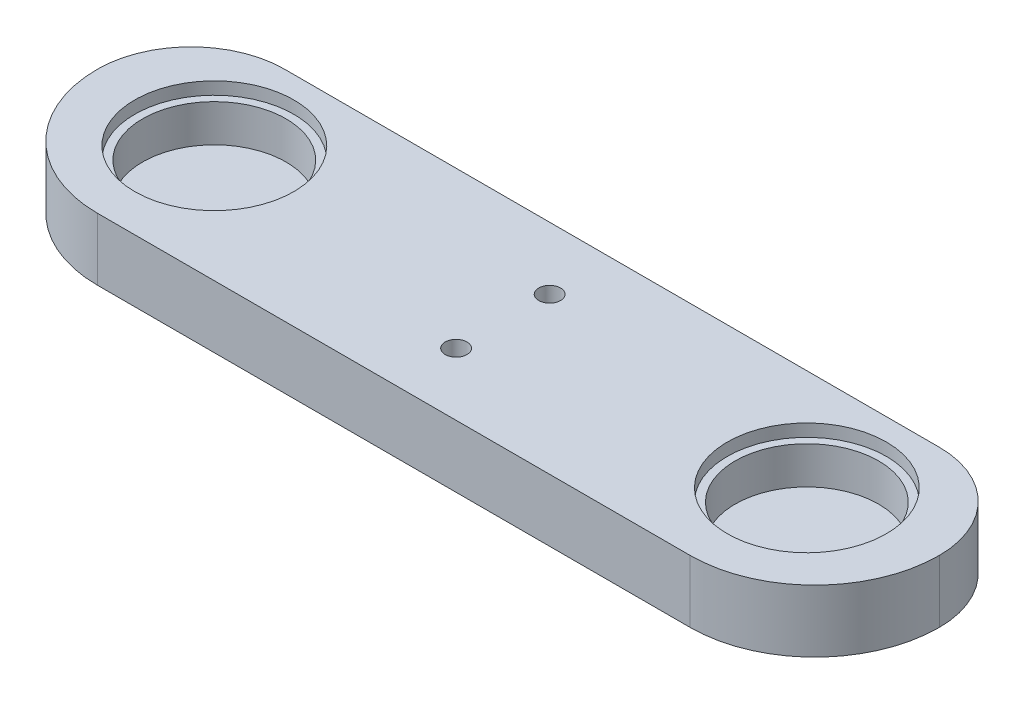
ISO-10303-21;
HEADER;
FILE_DESCRIPTION(('STEP AP214'),'2;1');
FILE_NAME('part.step','',(''),(''),'','','');
FILE_SCHEMA(('AUTOMOTIVE_DESIGN { 1 0 10303 214 1 1 1 1 }'));
ENDSEC;
DATA;
#1=APPLICATION_CONTEXT('core data for automotive mechanical design processes');
#2=APPLICATION_PROTOCOL_DEFINITION('international standard','automotive_design',2000,#1);
#3=PRODUCT_CONTEXT('',#1,'mechanical');
#4=PRODUCT('Part','Part','',(#3));
#5=PRODUCT_RELATED_PRODUCT_CATEGORY('part','',(#4));
#6=PRODUCT_DEFINITION_FORMATION('','',#4);
#7=PRODUCT_DEFINITION_CONTEXT('part definition',#1,'design');
#8=PRODUCT_DEFINITION('design','',#6,#7);
#9=PRODUCT_DEFINITION_SHAPE('','',#8);
#10=(LENGTH_UNIT() NAMED_UNIT(*) SI_UNIT(.MILLI.,.METRE.));
#11=(NAMED_UNIT(*) PLANE_ANGLE_UNIT() SI_UNIT($,.RADIAN.));
#12=(NAMED_UNIT(*) SI_UNIT($,.STERADIAN.) SOLID_ANGLE_UNIT());
#13=UNCERTAINTY_MEASURE_WITH_UNIT(LENGTH_MEASURE(1.E-05),#10,'distance_accuracy_value','');
#14=(GEOMETRIC_REPRESENTATION_CONTEXT(3) GLOBAL_UNCERTAINTY_ASSIGNED_CONTEXT((#13)) GLOBAL_UNIT_ASSIGNED_CONTEXT((#10,
#11,#12)) REPRESENTATION_CONTEXT('',''));
#15=CARTESIAN_POINT('',(0.,0.,0.));
#16=DIRECTION('',(0.,0.,1.));
#17=DIRECTION('',(1.,0.,0.));
#18=AXIS2_PLACEMENT_3D('',#15,#16,#17);
#19=CARTESIAN_POINT('',(19.7497982410927,-0.000999999999999265,15.6230701462917));
#20=DIRECTION('',(0.,1.,0.));
#21=DIRECTION('',(0.,0.,1.));
#22=AXIS2_PLACEMENT_3D('',#19,#20,#21);
#23=CYLINDRICAL_SURFACE('',#22,1.75);
#24=CARTESIAN_POINT('',(19.7497982410927,10.,15.6230701462917));
#25=DIRECTION('',(0.,1.,0.));
#26=DIRECTION('',(0.,0.,1.));
#27=AXIS2_PLACEMENT_3D('',#24,#25,#26);
#28=CIRCLE('',#27,1.75);
#29=CARTESIAN_POINT('',(19.7497982410927,10.,17.3730701462917));
#30=VERTEX_POINT('',#29);
#31=EDGE_CURVE('E133',#30,#30,#28,.T.);
#32=ORIENTED_EDGE('',*,*,#31,.T.);
#33=EDGE_LOOP('',(#32));
#34=FACE_BOUND('',#33,.T.);
#35=CARTESIAN_POINT('',(19.7497982410927,4.,15.6230701462917));
#36=DIRECTION('',(0.,-1.,0.));
#37=DIRECTION('',(0.,0.,-1.));
#38=AXIS2_PLACEMENT_3D('',#35,#36,#37);
#39=CIRCLE('',#38,1.75);
#40=CARTESIAN_POINT('',(19.7497982410927,4.,13.8730701462917));
#41=VERTEX_POINT('',#40);
#42=EDGE_CURVE('E129',#41,#41,#39,.F.);
#43=ORIENTED_EDGE('',*,*,#42,.F.);
#44=EDGE_LOOP('',(#43));
#45=FACE_BOUND('',#44,.T.);
#46=ADVANCED_FACE('F32',(#34,#45),#23,.F.);
#47=CARTESIAN_POINT('',(19.7497982410927,-0.000999999999999265,0.623070146291696));
#48=DIRECTION('',(0.,1.,0.));
#49=DIRECTION('',(0.,0.,1.));
#50=AXIS2_PLACEMENT_3D('',#47,#48,#49);
#51=CYLINDRICAL_SURFACE('',#50,1.75);
#52=CARTESIAN_POINT('',(19.7497982410927,10.,0.623070146291696));
#53=DIRECTION('',(0.,1.,0.));
#54=DIRECTION('',(0.,0.,1.));
#55=AXIS2_PLACEMENT_3D('',#52,#53,#54);
#56=CIRCLE('',#55,1.75);
#57=CARTESIAN_POINT('',(19.7497982410927,10.,2.37307014629169));
#58=VERTEX_POINT('',#57);
#59=EDGE_CURVE('E187',#58,#58,#56,.T.);
#60=ORIENTED_EDGE('',*,*,#59,.T.);
#61=EDGE_LOOP('',(#60));
#62=FACE_BOUND('',#61,.T.);
#63=CARTESIAN_POINT('',(19.7497982410927,4.,0.623070146291696));
#64=DIRECTION('',(0.,-1.,0.));
#65=DIRECTION('',(0.,0.,-1.));
#66=AXIS2_PLACEMENT_3D('',#63,#64,#65);
#67=CIRCLE('',#66,1.75);
#68=CARTESIAN_POINT('',(19.7497982410927,4.,-1.1269298537083));
#69=VERTEX_POINT('',#68);
#70=EDGE_CURVE('E126',#69,#69,#67,.F.);
#71=ORIENTED_EDGE('',*,*,#70,.F.);
#72=EDGE_LOOP('',(#71));
#73=FACE_BOUND('',#72,.T.);
#74=ADVANCED_FACE('F237',(#62,#73),#51,.F.);
#75=CARTESIAN_POINT('',(-47.7502017589073,10.,25.6230701462917));
#76=DIRECTION('',(0.,0.,-1.));
#77=DIRECTION('',(-1.,0.,0.));
#78=AXIS2_PLACEMENT_3D('',#75,#76,#77);
#79=PLANE('',#78);
#80=DIRECTION('',(1.,0.,0.));
#81=VECTOR('',#80,1.);
#82=CARTESIAN_POINT('',(-47.7502017589073,0.,25.6230701462917));
#83=LINE('',#82,#81);
#84=CARTESIAN_POINT('',(-27.7502017589073,0.,25.6230701462917));
#85=VERTEX_POINT('',#84);
#86=CARTESIAN_POINT('',(67.2497982410927,0.,25.6230701462917));
#87=VERTEX_POINT('',#86);
#88=EDGE_CURVE('E147',#85,#87,#83,.T.);
#89=ORIENTED_EDGE('',*,*,#88,.T.);
#90=DIRECTION('',(0.,-1.,0.));
#91=VECTOR('',#90,1.);
#92=CARTESIAN_POINT('',(67.2497982410927,10.,25.6230701462917));
#93=LINE('',#92,#91);
#94=CARTESIAN_POINT('',(67.2497982410927,10.,25.6230701462917));
#95=VERTEX_POINT('',#94);
#96=EDGE_CURVE('E102',#87,#95,#93,.F.);
#97=ORIENTED_EDGE('',*,*,#96,.T.);
#98=DIRECTION('',(1.,0.,0.));
#99=VECTOR('',#98,1.);
#100=CARTESIAN_POINT('',(-47.7502017589073,10.,25.6230701462917));
#101=LINE('',#100,#99);
#102=CARTESIAN_POINT('',(-27.7502017589073,10.,25.6230701462917));
#103=VERTEX_POINT('',#102);
#104=EDGE_CURVE('E111',#103,#95,#101,.T.);
#105=ORIENTED_EDGE('',*,*,#104,.F.);
#106=DIRECTION('',(0.,-1.,0.));
#107=VECTOR('',#106,1.);
#108=CARTESIAN_POINT('',(-27.7502017589073,10.,25.6230701462917));
#109=LINE('',#108,#107);
#110=EDGE_CURVE('E103',#103,#85,#109,.T.);
#111=ORIENTED_EDGE('',*,*,#110,.T.);
#112=EDGE_LOOP('',(#89,#97,#105,#111));
#113=FACE_BOUND('',#112,.T.);
#114=ADVANCED_FACE('F149',(#113),#79,.F.);
#115=CARTESIAN_POINT('',(-47.7502017589073,10.,-9.3769298537083));
#116=DIRECTION('',(0.,0.,1.));
#117=DIRECTION('',(1.,0.,0.));
#118=AXIS2_PLACEMENT_3D('',#115,#116,#117);
#119=PLANE('',#118);
#120=DIRECTION('',(-1.,0.,0.));
#121=VECTOR('',#120,1.);
#122=CARTESIAN_POINT('',(-47.7502017589073,10.,-9.3769298537083));
#123=LINE('',#122,#121);
#124=CARTESIAN_POINT('',(72.2497982410927,10.,-9.3769298537083));
#125=VERTEX_POINT('',#124);
#126=CARTESIAN_POINT('',(-32.7502017589073,10.,-9.3769298537083));
#127=VERTEX_POINT('',#126);
#128=EDGE_CURVE('E107',#125,#127,#123,.T.);
#129=ORIENTED_EDGE('',*,*,#128,.F.);
#130=DIRECTION('',(0.,-1.,0.));
#131=VECTOR('',#130,1.);
#132=CARTESIAN_POINT('',(72.2497982410927,10.,-9.3769298537083));
#133=LINE('',#132,#131);
#134=CARTESIAN_POINT('',(72.2497982410927,0.,-9.3769298537083));
#135=VERTEX_POINT('',#134);
#136=EDGE_CURVE('E135',#125,#135,#133,.T.);
#137=ORIENTED_EDGE('',*,*,#136,.T.);
#138=DIRECTION('',(-1.,0.,0.));
#139=VECTOR('',#138,1.);
#140=CARTESIAN_POINT('',(-47.7502017589073,0.,-9.3769298537083));
#141=LINE('',#140,#139);
#142=CARTESIAN_POINT('',(-32.7502017589073,0.,-9.3769298537083));
#143=VERTEX_POINT('',#142);
#144=EDGE_CURVE('E89',#135,#143,#141,.T.);
#145=ORIENTED_EDGE('',*,*,#144,.T.);
#146=DIRECTION('',(0.,-1.,0.));
#147=VECTOR('',#146,1.);
#148=CARTESIAN_POINT('',(-32.7502017589073,10.,-9.3769298537083));
#149=LINE('',#148,#147);
#150=EDGE_CURVE('E47',#143,#127,#149,.F.);
#151=ORIENTED_EDGE('',*,*,#150,.T.);
#152=EDGE_LOOP('',(#129,#137,#145,#151));
#153=FACE_BOUND('',#152,.T.);
#154=ADVANCED_FACE('F275',(#153),#119,.F.);
#155=CARTESIAN_POINT('',(0.,10.,0.));
#156=DIRECTION('',(0.,1.,0.));
#157=DIRECTION('',(0.,0.,1.));
#158=AXIS2_PLACEMENT_3D('',#155,#156,#157);
#159=PLANE('',#158);
#160=ORIENTED_EDGE('',*,*,#59,.F.);
#161=EDGE_LOOP('',(#160));
#162=FACE_BOUND('',#161,.T.);
#163=ORIENTED_EDGE('',*,*,#31,.F.);
#164=EDGE_LOOP('',(#163));
#165=FACE_BOUND('',#164,.T.);
#166=CARTESIAN_POINT('',(-27.7502017589073,10.,6.88629089006511));
#167=DIRECTION('',(0.,1.,0.));
#168=DIRECTION('',(0.,0.,1.));
#169=AXIS2_PLACEMENT_3D('',#166,#167,#168);
#170=CIRCLE('',#169,12.75);
#171=CARTESIAN_POINT('',(-27.7502017589073,10.,19.6362908900651));
#172=VERTEX_POINT('',#171);
#173=EDGE_CURVE('E156',#172,#172,#170,.T.);
#174=ORIENTED_EDGE('',*,*,#173,.F.);
#175=EDGE_LOOP('',(#174));
#176=FACE_BOUND('',#175,.T.);
#177=CARTESIAN_POINT('',(67.2497982410927,10.,6.88629089006511));
#178=DIRECTION('',(0.,1.,0.));
#179=DIRECTION('',(0.,0.,-1.));
#180=AXIS2_PLACEMENT_3D('',#177,#178,#179);
#181=CIRCLE('',#180,12.75);
#182=CARTESIAN_POINT('',(67.2497982410927,10.,-5.86370910993491));
#183=VERTEX_POINT('',#182);
#184=EDGE_CURVE('E152',#183,#183,#181,.T.);
#185=ORIENTED_EDGE('',*,*,#184,.F.);
#186=EDGE_LOOP('',(#185));
#187=FACE_BOUND('',#186,.T.);
#188=CARTESIAN_POINT('',(67.2497982410927,10.,5.6230701462917));
#189=DIRECTION('',(0.,1.,0.));
#190=DIRECTION('',(0.,0.,1.));
#191=AXIS2_PLACEMENT_3D('',#188,#189,#190);
#192=CIRCLE('',#191,20.);
#193=CARTESIAN_POINT('',(87.2497982410927,10.,5.6230701462917));
#194=VERTEX_POINT('',#193);
#195=EDGE_CURVE('E121',#95,#194,#192,.T.);
#196=ORIENTED_EDGE('',*,*,#195,.T.);
#197=CARTESIAN_POINT('',(72.2497982410927,10.,5.62307014629169));
#198=DIRECTION('',(0.,1.,0.));
#199=DIRECTION('',(0.,0.,1.));
#200=AXIS2_PLACEMENT_3D('',#197,#198,#199);
#201=CIRCLE('',#200,15.);
#202=EDGE_CURVE('E11',#194,#125,#201,.T.);
#203=ORIENTED_EDGE('',*,*,#202,.T.);
#204=ORIENTED_EDGE('',*,*,#128,.T.);
#205=CARTESIAN_POINT('',(-32.7502017589073,10.,5.62307014629169));
#206=DIRECTION('',(0.,1.,0.));
#207=DIRECTION('',(0.,0.,1.));
#208=AXIS2_PLACEMENT_3D('',#205,#206,#207);
#209=CIRCLE('',#208,15.);
#210=CARTESIAN_POINT('',(-47.7502017589073,10.,5.6230701462917));
#211=VERTEX_POINT('',#210);
#212=EDGE_CURVE('E40',#127,#211,#209,.T.);
#213=ORIENTED_EDGE('',*,*,#212,.T.);
#214=CARTESIAN_POINT('',(-27.7502017589073,10.,5.6230701462917));
#215=DIRECTION('',(0.,1.,0.));
#216=DIRECTION('',(0.,0.,1.));
#217=AXIS2_PLACEMENT_3D('',#214,#215,#216);
#218=CIRCLE('',#217,20.);
#219=EDGE_CURVE('E119',#211,#103,#218,.T.);
#220=ORIENTED_EDGE('',*,*,#219,.T.);
#221=ORIENTED_EDGE('',*,*,#104,.T.);
#222=EDGE_LOOP('',(#196,#203,#204,#213,#220,#221));
#223=FACE_BOUND('',#222,.T.);
#224=ADVANCED_FACE('F139',(#162,#165,#176,#187,#223),#159,.T.);
#225=CARTESIAN_POINT('',(0.,0.,0.));
#226=DIRECTION('',(0.,1.,0.));
#227=DIRECTION('',(0.,0.,1.));
#228=AXIS2_PLACEMENT_3D('',#225,#226,#227);
#229=PLANE('',#228);
#230=CARTESIAN_POINT('',(19.7497982410927,0.,15.6230701462917));
#231=DIRECTION('',(0.,-1.,0.));
#232=DIRECTION('',(0.,0.,-1.));
#233=AXIS2_PLACEMENT_3D('',#230,#231,#232);
#234=CIRCLE('',#233,3.1);
#235=CARTESIAN_POINT('',(19.7497982410927,0.,12.5230701462917));
#236=VERTEX_POINT('',#235);
#237=EDGE_CURVE('E201',#236,#236,#234,.T.);
#238=ORIENTED_EDGE('',*,*,#237,.F.);
#239=EDGE_LOOP('',(#238));
#240=FACE_BOUND('',#239,.T.);
#241=CARTESIAN_POINT('',(19.7497982410927,0.,0.623070146291696));
#242=DIRECTION('',(0.,-1.,0.));
#243=DIRECTION('',(0.,0.,-1.));
#244=AXIS2_PLACEMENT_3D('',#241,#242,#243);
#245=CIRCLE('',#244,3.1);
#246=CARTESIAN_POINT('',(19.7497982410927,0.,-2.47692985370831));
#247=VERTEX_POINT('',#246);
#248=EDGE_CURVE('E195',#247,#247,#245,.T.);
#249=ORIENTED_EDGE('',*,*,#248,.F.);
#250=EDGE_LOOP('',(#249));
#251=FACE_BOUND('',#250,.T.);
#252=ORIENTED_EDGE('',*,*,#144,.F.);
#253=CARTESIAN_POINT('',(72.2497982410927,0.,5.62307014629169));
#254=DIRECTION('',(0.,1.,0.));
#255=DIRECTION('',(0.,0.,1.));
#256=AXIS2_PLACEMENT_3D('',#253,#254,#255);
#257=CIRCLE('',#256,15.);
#258=CARTESIAN_POINT('',(87.2497982410927,0.,5.6230701462917));
#259=VERTEX_POINT('',#258);
#260=EDGE_CURVE('E83',#135,#259,#257,.F.);
#261=ORIENTED_EDGE('',*,*,#260,.T.);
#262=CARTESIAN_POINT('',(67.2497982410927,0.,5.6230701462917));
#263=DIRECTION('',(0.,1.,0.));
#264=DIRECTION('',(0.,0.,1.));
#265=AXIS2_PLACEMENT_3D('',#262,#263,#264);
#266=CIRCLE('',#265,20.);
#267=EDGE_CURVE('E87',#259,#87,#266,.F.);
#268=ORIENTED_EDGE('',*,*,#267,.T.);
#269=ORIENTED_EDGE('',*,*,#88,.F.);
#270=CARTESIAN_POINT('',(-27.7502017589073,0.,5.6230701462917));
#271=DIRECTION('',(0.,1.,0.));
#272=DIRECTION('',(0.,0.,1.));
#273=AXIS2_PLACEMENT_3D('',#270,#271,#272);
#274=CIRCLE('',#273,20.);
#275=CARTESIAN_POINT('',(-47.7502017589073,0.,5.6230701462917));
#276=VERTEX_POINT('',#275);
#277=EDGE_CURVE('E104',#85,#276,#274,.F.);
#278=ORIENTED_EDGE('',*,*,#277,.T.);
#279=CARTESIAN_POINT('',(-32.7502017589073,0.,5.62307014629169));
#280=DIRECTION('',(0.,1.,0.));
#281=DIRECTION('',(0.,0.,1.));
#282=AXIS2_PLACEMENT_3D('',#279,#280,#281);
#283=CIRCLE('',#282,15.);
#284=EDGE_CURVE('E94',#276,#143,#283,.F.);
#285=ORIENTED_EDGE('',*,*,#284,.T.);
#286=EDGE_LOOP('',(#252,#261,#268,#269,#278,#285));
#287=FACE_BOUND('',#286,.T.);
#288=ADVANCED_FACE('F85',(#240,#251,#287),#229,.F.);
#289=CARTESIAN_POINT('',(67.2497982410927,10.,5.6230701462917));
#290=DIRECTION('',(0.,-1.,0.));
#291=DIRECTION('',(0.,0.,-1.));
#292=AXIS2_PLACEMENT_3D('',#289,#290,#291);
#293=CYLINDRICAL_SURFACE('',#292,20.);
#294=ORIENTED_EDGE('',*,*,#195,.F.);
#295=ORIENTED_EDGE('',*,*,#96,.F.);
#296=ORIENTED_EDGE('',*,*,#267,.F.);
#297=DIRECTION('',(0.,-1.,0.));
#298=VECTOR('',#297,1.);
#299=CARTESIAN_POINT('',(87.2497982410927,10.,5.6230701462917));
#300=LINE('',#299,#298);
#301=EDGE_CURVE('E101',#194,#259,#300,.T.);
#302=ORIENTED_EDGE('',*,*,#301,.F.);
#303=EDGE_LOOP('',(#294,#295,#296,#302));
#304=FACE_BOUND('',#303,.T.);
#305=ADVANCED_FACE('F100',(#304),#293,.T.);
#306=CARTESIAN_POINT('',(-27.7502017589073,10.,5.6230701462917));
#307=DIRECTION('',(0.,-1.,0.));
#308=DIRECTION('',(0.,0.,-1.));
#309=AXIS2_PLACEMENT_3D('',#306,#307,#308);
#310=CYLINDRICAL_SURFACE('',#309,20.);
#311=ORIENTED_EDGE('',*,*,#219,.F.);
#312=DIRECTION('',(0.,-1.,0.));
#313=VECTOR('',#312,1.);
#314=CARTESIAN_POINT('',(-47.7502017589073,10.,5.6230701462917));
#315=LINE('',#314,#313);
#316=EDGE_CURVE('E123',#276,#211,#315,.F.);
#317=ORIENTED_EDGE('',*,*,#316,.F.);
#318=ORIENTED_EDGE('',*,*,#277,.F.);
#319=ORIENTED_EDGE('',*,*,#110,.F.);
#320=EDGE_LOOP('',(#311,#317,#318,#319));
#321=FACE_BOUND('',#320,.T.);
#322=ADVANCED_FACE('F146',(#321),#310,.T.);
#323=CARTESIAN_POINT('',(67.2497982410927,8.,6.88629089006511));
#324=DIRECTION('',(0.,1.,0.));
#325=DIRECTION('',(0.,0.,1.));
#326=AXIS2_PLACEMENT_3D('',#323,#324,#325);
#327=CYLINDRICAL_SURFACE('',#326,12.75);
#328=CARTESIAN_POINT('',(67.2497982410927,8.,6.88629089006511));
#329=DIRECTION('',(0.,1.,0.));
#330=DIRECTION('',(0.,0.,-1.));
#331=AXIS2_PLACEMENT_3D('',#328,#329,#330);
#332=CIRCLE('',#331,12.75);
#333=CARTESIAN_POINT('',(67.2497982410927,8.,-5.86370910993491));
#334=VERTEX_POINT('',#333);
#335=EDGE_CURVE('E161',#334,#334,#332,.T.);
#336=ORIENTED_EDGE('',*,*,#335,.F.);
#337=EDGE_LOOP('',(#336));
#338=FACE_BOUND('',#337,.T.);
#339=ORIENTED_EDGE('',*,*,#184,.T.);
#340=EDGE_LOOP('',(#339));
#341=FACE_BOUND('',#340,.T.);
#342=ADVANCED_FACE('F269',(#338,#341),#327,.F.);
#343=CARTESIAN_POINT('',(67.2497982410927,8.,6.88629089006511));
#344=DIRECTION('',(0.,-1.,0.));
#345=DIRECTION('',(0.,0.,-1.));
#346=AXIS2_PLACEMENT_3D('',#343,#344,#345);
#347=PLANE('',#346);
#348=CARTESIAN_POINT('',(67.2497982410927,8.,6.88629089006511));
#349=DIRECTION('',(0.,1.,0.));
#350=DIRECTION('',(0.,0.,-1.));
#351=AXIS2_PLACEMENT_3D('',#348,#349,#350);
#352=CIRCLE('',#351,11.5);
#353=CARTESIAN_POINT('',(67.2497982410927,8.,-4.6137091099349));
#354=VERTEX_POINT('',#353);
#355=EDGE_CURVE('E164',#354,#354,#352,.T.);
#356=ORIENTED_EDGE('',*,*,#355,.F.);
#357=EDGE_LOOP('',(#356));
#358=FACE_BOUND('',#357,.T.);
#359=ORIENTED_EDGE('',*,*,#335,.T.);
#360=EDGE_LOOP('',(#359));
#361=FACE_BOUND('',#360,.T.);
#362=ADVANCED_FACE('F265',(#358,#361),#347,.F.);
#363=CARTESIAN_POINT('',(-27.7502017589073,8.,6.88629089006511));
#364=DIRECTION('',(0.,1.,0.));
#365=DIRECTION('',(0.,0.,1.));
#366=AXIS2_PLACEMENT_3D('',#363,#364,#365);
#367=CYLINDRICAL_SURFACE('',#366,12.75);
#368=CARTESIAN_POINT('',(-27.7502017589073,8.,6.88629089006511));
#369=DIRECTION('',(0.,1.,0.));
#370=DIRECTION('',(0.,0.,1.));
#371=AXIS2_PLACEMENT_3D('',#368,#369,#370);
#372=CIRCLE('',#371,12.75);
#373=CARTESIAN_POINT('',(-27.7502017589073,8.,19.6362908900651));
#374=VERTEX_POINT('',#373);
#375=EDGE_CURVE('E154',#374,#374,#372,.T.);
#376=ORIENTED_EDGE('',*,*,#375,.F.);
#377=EDGE_LOOP('',(#376));
#378=FACE_BOUND('',#377,.T.);
#379=ORIENTED_EDGE('',*,*,#173,.T.);
#380=EDGE_LOOP('',(#379));
#381=FACE_BOUND('',#380,.T.);
#382=ADVANCED_FACE('F261',(#378,#381),#367,.F.);
#383=CARTESIAN_POINT('',(-27.7502017589073,8.,6.88629089006511));
#384=DIRECTION('',(0.,1.,0.));
#385=DIRECTION('',(0.,0.,1.));
#386=AXIS2_PLACEMENT_3D('',#383,#384,#385);
#387=PLANE('',#386);
#388=CARTESIAN_POINT('',(-27.7502017589073,8.,6.88629089006511));
#389=DIRECTION('',(0.,1.,0.));
#390=DIRECTION('',(0.,0.,1.));
#391=AXIS2_PLACEMENT_3D('',#388,#389,#390);
#392=CIRCLE('',#391,11.5);
#393=CARTESIAN_POINT('',(-27.7502017589073,8.,18.3862908900651));
#394=VERTEX_POINT('',#393);
#395=EDGE_CURVE('E174',#394,#394,#392,.T.);
#396=ORIENTED_EDGE('',*,*,#395,.F.);
#397=EDGE_LOOP('',(#396));
#398=FACE_BOUND('',#397,.T.);
#399=ORIENTED_EDGE('',*,*,#375,.T.);
#400=EDGE_LOOP('',(#399));
#401=FACE_BOUND('',#400,.T.);
#402=ADVANCED_FACE('F252',(#398,#401),#387,.T.);
#403=CARTESIAN_POINT('',(-27.7502017589073,2.,6.88629089006511));
#404=DIRECTION('',(0.,1.,0.));
#405=DIRECTION('',(0.,0.,1.));
#406=AXIS2_PLACEMENT_3D('',#403,#404,#405);
#407=CYLINDRICAL_SURFACE('',#406,11.5);
#408=CARTESIAN_POINT('',(-27.7502017589073,2.,6.88629089006511));
#409=DIRECTION('',(0.,1.,0.));
#410=DIRECTION('',(0.,0.,1.));
#411=AXIS2_PLACEMENT_3D('',#408,#409,#410);
#412=CIRCLE('',#411,11.5);
#413=CARTESIAN_POINT('',(-27.7502017589073,2.,18.3862908900651));
#414=VERTEX_POINT('',#413);
#415=EDGE_CURVE('E170',#414,#414,#412,.T.);
#416=ORIENTED_EDGE('',*,*,#415,.F.);
#417=EDGE_LOOP('',(#416));
#418=FACE_BOUND('',#417,.T.);
#419=ORIENTED_EDGE('',*,*,#395,.T.);
#420=EDGE_LOOP('',(#419));
#421=FACE_BOUND('',#420,.T.);
#422=ADVANCED_FACE('F249',(#418,#421),#407,.F.);
#423=CARTESIAN_POINT('',(-27.7502017589073,2.,6.88629089006511));
#424=DIRECTION('',(0.,1.,0.));
#425=DIRECTION('',(0.,0.,1.));
#426=AXIS2_PLACEMENT_3D('',#423,#424,#425);
#427=PLANE('',#426);
#428=ORIENTED_EDGE('',*,*,#415,.T.);
#429=EDGE_LOOP('',(#428));
#430=FACE_BOUND('',#429,.T.);
#431=ADVANCED_FACE('F245',(#430),#427,.T.);
#432=CARTESIAN_POINT('',(67.2497982410927,2.,6.88629089006511));
#433=DIRECTION('',(0.,1.,0.));
#434=DIRECTION('',(0.,0.,1.));
#435=AXIS2_PLACEMENT_3D('',#432,#433,#434);
#436=CYLINDRICAL_SURFACE('',#435,11.5);
#437=CARTESIAN_POINT('',(67.2497982410927,2.,6.88629089006511));
#438=DIRECTION('',(0.,1.,0.));
#439=DIRECTION('',(0.,0.,-1.));
#440=AXIS2_PLACEMENT_3D('',#437,#438,#439);
#441=CIRCLE('',#440,11.5);
#442=CARTESIAN_POINT('',(67.2497982410927,2.,-4.6137091099349));
#443=VERTEX_POINT('',#442);
#444=EDGE_CURVE('E179',#443,#443,#441,.T.);
#445=ORIENTED_EDGE('',*,*,#444,.F.);
#446=EDGE_LOOP('',(#445));
#447=FACE_BOUND('',#446,.T.);
#448=ORIENTED_EDGE('',*,*,#355,.T.);
#449=EDGE_LOOP('',(#448));
#450=FACE_BOUND('',#449,.T.);
#451=ADVANCED_FACE('F248',(#447,#450),#436,.F.);
#452=CARTESIAN_POINT('',(67.2497982410927,2.,6.88629089006511));
#453=DIRECTION('',(0.,-1.,0.));
#454=DIRECTION('',(0.,0.,-1.));
#455=AXIS2_PLACEMENT_3D('',#452,#453,#454);
#456=PLANE('',#455);
#457=ORIENTED_EDGE('',*,*,#444,.T.);
#458=EDGE_LOOP('',(#457));
#459=FACE_BOUND('',#458,.T.);
#460=ADVANCED_FACE('F231',(#459),#456,.F.);
#461=CARTESIAN_POINT('',(19.7497982410927,4.,0.623070146291696));
#462=DIRECTION('',(0.,-1.,0.));
#463=DIRECTION('',(0.,0.,-1.));
#464=AXIS2_PLACEMENT_3D('',#461,#462,#463);
#465=PLANE('',#464);
#466=CARTESIAN_POINT('',(19.7497982410927,4.,0.623070146291696));
#467=DIRECTION('',(0.,-1.,0.));
#468=DIRECTION('',(0.,0.,-1.));
#469=AXIS2_PLACEMENT_3D('',#466,#467,#468);
#470=CIRCLE('',#469,3.1);
#471=CARTESIAN_POINT('',(19.7497982410927,4.,-2.47692985370831));
#472=VERTEX_POINT('',#471);
#473=EDGE_CURVE('E198',#472,#472,#470,.T.);
#474=ORIENTED_EDGE('',*,*,#473,.T.);
#475=EDGE_LOOP('',(#474));
#476=FACE_BOUND('',#475,.T.);
#477=ORIENTED_EDGE('',*,*,#70,.T.);
#478=EDGE_LOOP('',(#477));
#479=FACE_BOUND('',#478,.T.);
#480=ADVANCED_FACE('F223',(#476,#479),#465,.T.);
#481=CARTESIAN_POINT('',(19.7497982410927,4.,0.623070146291696));
#482=DIRECTION('',(0.,-1.,0.));
#483=DIRECTION('',(0.,0.,-1.));
#484=AXIS2_PLACEMENT_3D('',#481,#482,#483);
#485=CYLINDRICAL_SURFACE('',#484,3.1);
#486=ORIENTED_EDGE('',*,*,#473,.F.);
#487=EDGE_LOOP('',(#486));
#488=FACE_BOUND('',#487,.T.);
#489=ORIENTED_EDGE('',*,*,#248,.T.);
#490=EDGE_LOOP('',(#489));
#491=FACE_BOUND('',#490,.T.);
#492=ADVANCED_FACE('F221',(#488,#491),#485,.F.);
#493=CARTESIAN_POINT('',(19.7497982410927,4.,15.6230701462917));
#494=DIRECTION('',(0.,-1.,0.));
#495=DIRECTION('',(0.,0.,-1.));
#496=AXIS2_PLACEMENT_3D('',#493,#494,#495);
#497=PLANE('',#496);
#498=CARTESIAN_POINT('',(19.7497982410927,4.,15.6230701462917));
#499=DIRECTION('',(0.,-1.,0.));
#500=DIRECTION('',(0.,0.,-1.));
#501=AXIS2_PLACEMENT_3D('',#498,#499,#500);
#502=CIRCLE('',#501,3.1);
#503=CARTESIAN_POINT('',(19.7497982410927,4.,12.5230701462917));
#504=VERTEX_POINT('',#503);
#505=EDGE_CURVE('E130',#504,#504,#502,.T.);
#506=ORIENTED_EDGE('',*,*,#505,.T.);
#507=EDGE_LOOP('',(#506));
#508=FACE_BOUND('',#507,.T.);
#509=ORIENTED_EDGE('',*,*,#42,.T.);
#510=EDGE_LOOP('',(#509));
#511=FACE_BOUND('',#510,.T.);
#512=ADVANCED_FACE('F207',(#508,#511),#497,.T.);
#513=CARTESIAN_POINT('',(19.7497982410927,4.,15.6230701462917));
#514=DIRECTION('',(0.,-1.,0.));
#515=DIRECTION('',(0.,0.,-1.));
#516=AXIS2_PLACEMENT_3D('',#513,#514,#515);
#517=CYLINDRICAL_SURFACE('',#516,3.1);
#518=ORIENTED_EDGE('',*,*,#505,.F.);
#519=EDGE_LOOP('',(#518));
#520=FACE_BOUND('',#519,.T.);
#521=ORIENTED_EDGE('',*,*,#237,.T.);
#522=EDGE_LOOP('',(#521));
#523=FACE_BOUND('',#522,.T.);
#524=ADVANCED_FACE('F210',(#520,#523),#517,.F.);
#525=CARTESIAN_POINT('',(72.2497982410927,10.,5.62307014629169));
#526=DIRECTION('',(0.,-1.,0.));
#527=DIRECTION('',(0.,0.,-1.));
#528=AXIS2_PLACEMENT_3D('',#525,#526,#527);
#529=CYLINDRICAL_SURFACE('',#528,15.);
#530=ORIENTED_EDGE('',*,*,#202,.F.);
#531=ORIENTED_EDGE('',*,*,#301,.T.);
#532=ORIENTED_EDGE('',*,*,#260,.F.);
#533=ORIENTED_EDGE('',*,*,#136,.F.);
#534=EDGE_LOOP('',(#530,#531,#532,#533));
#535=FACE_BOUND('',#534,.T.);
#536=ADVANCED_FACE('F106',(#535),#529,.T.);
#537=CARTESIAN_POINT('',(-32.7502017589073,10.,5.62307014629169));
#538=DIRECTION('',(0.,-1.,0.));
#539=DIRECTION('',(0.,0.,-1.));
#540=AXIS2_PLACEMENT_3D('',#537,#538,#539);
#541=CYLINDRICAL_SURFACE('',#540,15.);
#542=ORIENTED_EDGE('',*,*,#212,.F.);
#543=ORIENTED_EDGE('',*,*,#150,.F.);
#544=ORIENTED_EDGE('',*,*,#284,.F.);
#545=ORIENTED_EDGE('',*,*,#316,.T.);
#546=EDGE_LOOP('',(#542,#543,#544,#545));
#547=FACE_BOUND('',#546,.T.);
#548=ADVANCED_FACE('F34',(#547),#541,.T.);
#549=CLOSED_SHELL('',(#46,#74,#114,#154,#224,#288,#305,#322,#342,#362,#382,#402,#422,#431,#451,
#460,#480,#492,#512,#524,#536,#548));
#550=MANIFOLD_SOLID_BREP('B2',#549);
#551=ADVANCED_BREP_SHAPE_REPRESENTATION('',(#18,#550),#14);
#552=SHAPE_DEFINITION_REPRESENTATION(#9,#551);
ENDSEC;
END-ISO-10303-21;
